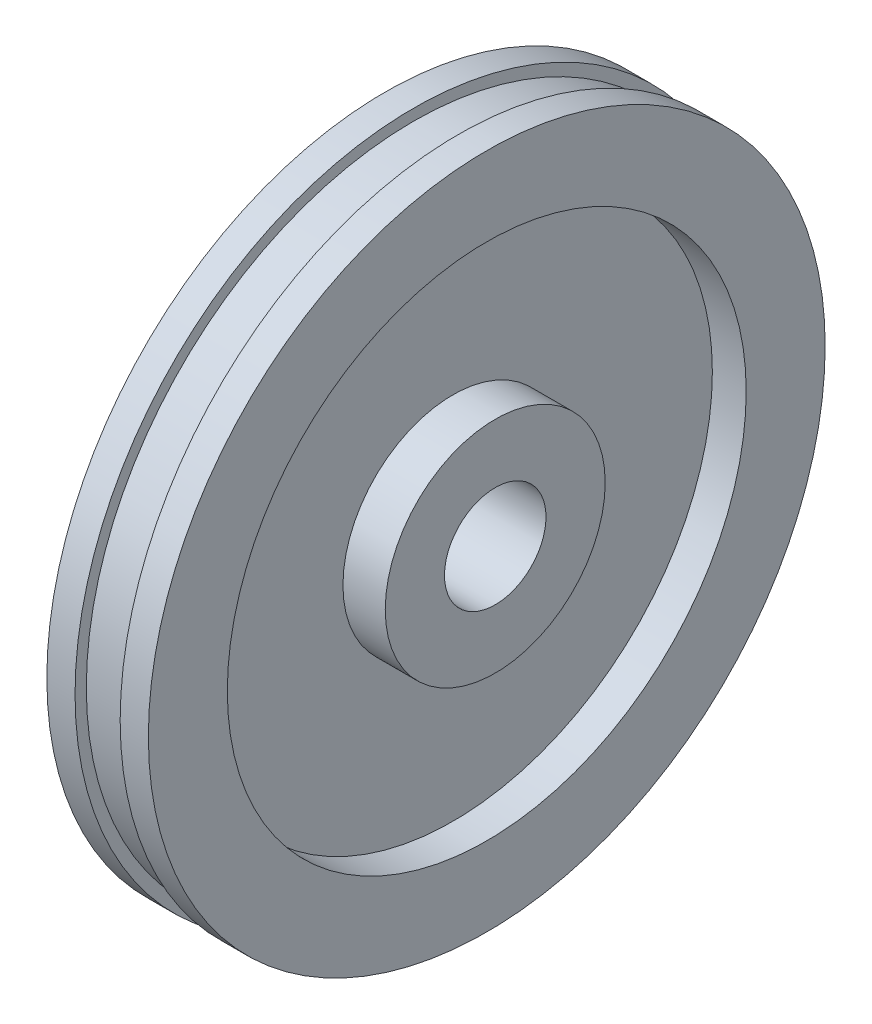
ISO-10303-21;
HEADER;
FILE_DESCRIPTION(('STEP AP214'),'2;1');
FILE_NAME('part.step','',(''),(''),'','','');
FILE_SCHEMA(('AUTOMOTIVE_DESIGN { 1 0 10303 214 1 1 1 1 }'));
ENDSEC;
DATA;
#1=APPLICATION_CONTEXT('core data for automotive mechanical design processes');
#2=APPLICATION_PROTOCOL_DEFINITION('international standard','automotive_design',2000,#1);
#3=PRODUCT_CONTEXT('',#1,'mechanical');
#4=PRODUCT('Part','Part','',(#3));
#5=PRODUCT_RELATED_PRODUCT_CATEGORY('part','',(#4));
#6=PRODUCT_DEFINITION_FORMATION('','',#4);
#7=PRODUCT_DEFINITION_CONTEXT('part definition',#1,'design');
#8=PRODUCT_DEFINITION('design','',#6,#7);
#9=PRODUCT_DEFINITION_SHAPE('','',#8);
#10=(LENGTH_UNIT() NAMED_UNIT(*) SI_UNIT(.MILLI.,.METRE.));
#11=(NAMED_UNIT(*) PLANE_ANGLE_UNIT() SI_UNIT($,.RADIAN.));
#12=(NAMED_UNIT(*) SI_UNIT($,.STERADIAN.) SOLID_ANGLE_UNIT());
#13=UNCERTAINTY_MEASURE_WITH_UNIT(LENGTH_MEASURE(1.E-05),#10,'distance_accuracy_value','');
#14=(GEOMETRIC_REPRESENTATION_CONTEXT(3) GLOBAL_UNCERTAINTY_ASSIGNED_CONTEXT((#13)) GLOBAL_UNIT_ASSIGNED_CONTEXT((#10,
#11,#12)) REPRESENTATION_CONTEXT('',''));
#15=CARTESIAN_POINT('',(0.,0.,0.));
#16=DIRECTION('',(0.,0.,1.));
#17=DIRECTION('',(1.,0.,0.));
#18=AXIS2_PLACEMENT_3D('',#15,#16,#17);
#19=CARTESIAN_POINT('',(0.,10.5,0.));
#20=DIRECTION('',(1.,0.,0.));
#21=DIRECTION('',(0.,0.,-1.));
#22=AXIS2_PLACEMENT_3D('',#19,#20,#21);
#23=PLANE('',#22);
#24=CARTESIAN_POINT('',(0.,-9.,0.));
#25=DIRECTION('',(-1.,0.,0.));
#26=DIRECTION('',(0.,0.,1.));
#27=AXIS2_PLACEMENT_3D('',#24,#25,#26);
#28=CIRCLE('',#27,9.);
#29=CARTESIAN_POINT('',(0.,-9.,9.));
#30=VERTEX_POINT('',#29);
#31=EDGE_CURVE('E10',#30,#30,#28,.T.);
#32=ORIENTED_EDGE('',*,*,#31,.F.);
#33=EDGE_LOOP('',(#32));
#34=FACE_BOUND('',#33,.T.);
#35=CARTESIAN_POINT('',(0.,-9.,0.));
#36=DIRECTION('',(-1.,0.,0.));
#37=DIRECTION('',(0.,0.,1.));
#38=AXIS2_PLACEMENT_3D('',#35,#36,#37);
#39=CIRCLE('',#38,19.5);
#40=CARTESIAN_POINT('',(0.,-9.,19.5));
#41=VERTEX_POINT('',#40);
#42=EDGE_CURVE('E89',#41,#41,#39,.T.);
#43=ORIENTED_EDGE('',*,*,#42,.T.);
#44=EDGE_LOOP('',(#43));
#45=FACE_BOUND('',#44,.T.);
#46=ADVANCED_FACE('F37',(#34,#45),#23,.F.);
#47=CARTESIAN_POINT('',(0.,-9.,0.));
#48=DIRECTION('',(-1.,0.,0.));
#49=DIRECTION('',(0.,0.,1.));
#50=AXIS2_PLACEMENT_3D('',#47,#48,#49);
#51=CYLINDRICAL_SURFACE('',#50,9.);
#52=CARTESIAN_POINT('',(21.,-9.,0.));
#53=DIRECTION('',(-1.,0.,0.));
#54=DIRECTION('',(0.,0.,1.));
#55=AXIS2_PLACEMENT_3D('',#52,#53,#54);
#56=CIRCLE('',#55,9.);
#57=CARTESIAN_POINT('',(21.,-9.,9.));
#58=VERTEX_POINT('',#57);
#59=EDGE_CURVE('E43',#58,#58,#56,.T.);
#60=ORIENTED_EDGE('',*,*,#59,.F.);
#61=EDGE_LOOP('',(#60));
#62=FACE_BOUND('',#61,.T.);
#63=ORIENTED_EDGE('',*,*,#31,.T.);
#64=EDGE_LOOP('',(#63));
#65=FACE_BOUND('',#64,.T.);
#66=ADVANCED_FACE('F174',(#62,#65),#51,.F.);
#67=CARTESIAN_POINT('',(21.,0.,0.));
#68=DIRECTION('',(-1.,0.,0.));
#69=DIRECTION('',(0.,0.,1.));
#70=AXIS2_PLACEMENT_3D('',#67,#68,#69);
#71=PLANE('',#70);
#72=CARTESIAN_POINT('',(21.,-9.,0.));
#73=DIRECTION('',(-1.,0.,0.));
#74=DIRECTION('',(0.,0.,1.));
#75=AXIS2_PLACEMENT_3D('',#72,#73,#74);
#76=CIRCLE('',#75,19.5);
#77=CARTESIAN_POINT('',(21.,-9.,19.5));
#78=VERTEX_POINT('',#77);
#79=EDGE_CURVE('E47',#78,#78,#76,.T.);
#80=ORIENTED_EDGE('',*,*,#79,.F.);
#81=EDGE_LOOP('',(#80));
#82=FACE_BOUND('',#81,.T.);
#83=ORIENTED_EDGE('',*,*,#59,.T.);
#84=EDGE_LOOP('',(#83));
#85=FACE_BOUND('',#84,.T.);
#86=ADVANCED_FACE('F169',(#82,#85),#71,.F.);
#87=CARTESIAN_POINT('',(0.,-9.,0.));
#88=DIRECTION('',(-1.,0.,0.));
#89=DIRECTION('',(0.,0.,1.));
#90=AXIS2_PLACEMENT_3D('',#87,#88,#89);
#91=CYLINDRICAL_SURFACE('',#90,19.5);
#92=CARTESIAN_POINT('',(13.5,-9.,0.));
#93=DIRECTION('',(-1.,0.,0.));
#94=DIRECTION('',(0.,0.,1.));
#95=AXIS2_PLACEMENT_3D('',#92,#93,#94);
#96=CIRCLE('',#95,19.5);
#97=CARTESIAN_POINT('',(13.5,-9.,19.5));
#98=VERTEX_POINT('',#97);
#99=EDGE_CURVE('E51',#98,#98,#96,.T.);
#100=ORIENTED_EDGE('',*,*,#99,.F.);
#101=EDGE_LOOP('',(#100));
#102=FACE_BOUND('',#101,.T.);
#103=ORIENTED_EDGE('',*,*,#79,.T.);
#104=EDGE_LOOP('',(#103));
#105=FACE_BOUND('',#104,.T.);
#106=ADVANCED_FACE('F163',(#102,#105),#91,.T.);
#107=CARTESIAN_POINT('',(13.5,10.5,0.));
#108=DIRECTION('',(-1.,0.,0.));
#109=DIRECTION('',(0.,0.,1.));
#110=AXIS2_PLACEMENT_3D('',#107,#108,#109);
#111=PLANE('',#110);
#112=CARTESIAN_POINT('',(13.5,-9.,0.));
#113=DIRECTION('',(-1.,0.,0.));
#114=DIRECTION('',(0.,0.,1.));
#115=AXIS2_PLACEMENT_3D('',#112,#113,#114);
#116=CIRCLE('',#115,46.);
#117=CARTESIAN_POINT('',(13.5,-9.,46.));
#118=VERTEX_POINT('',#117);
#119=EDGE_CURVE('E56',#118,#118,#116,.T.);
#120=ORIENTED_EDGE('',*,*,#119,.F.);
#121=EDGE_LOOP('',(#120));
#122=FACE_BOUND('',#121,.T.);
#123=ORIENTED_EDGE('',*,*,#99,.T.);
#124=EDGE_LOOP('',(#123));
#125=FACE_BOUND('',#124,.T.);
#126=ADVANCED_FACE('F157',(#122,#125),#111,.F.);
#127=CARTESIAN_POINT('',(0.,-9.,0.));
#128=DIRECTION('',(-1.,0.,0.));
#129=DIRECTION('',(0.,0.,1.));
#130=AXIS2_PLACEMENT_3D('',#127,#128,#129);
#131=CYLINDRICAL_SURFACE('',#130,46.);
#132=CARTESIAN_POINT('',(19.5,-9.,0.));
#133=DIRECTION('',(-1.,0.,0.));
#134=DIRECTION('',(0.,0.,1.));
#135=AXIS2_PLACEMENT_3D('',#132,#133,#134);
#136=CIRCLE('',#135,46.);
#137=CARTESIAN_POINT('',(19.5,-9.,46.));
#138=VERTEX_POINT('',#137);
#139=EDGE_CURVE('E59',#138,#138,#136,.T.);
#140=ORIENTED_EDGE('',*,*,#139,.F.);
#141=EDGE_LOOP('',(#140));
#142=FACE_BOUND('',#141,.T.);
#143=ORIENTED_EDGE('',*,*,#119,.T.);
#144=EDGE_LOOP('',(#143));
#145=FACE_BOUND('',#144,.T.);
#146=ADVANCED_FACE('F151',(#142,#145),#131,.F.);
#147=CARTESIAN_POINT('',(19.5,37.,0.));
#148=DIRECTION('',(-1.,0.,0.));
#149=DIRECTION('',(0.,0.,1.));
#150=AXIS2_PLACEMENT_3D('',#147,#148,#149);
#151=PLANE('',#150);
#152=CARTESIAN_POINT('',(19.5,-9.,0.));
#153=DIRECTION('',(-1.,0.,0.));
#154=DIRECTION('',(0.,0.,1.));
#155=AXIS2_PLACEMENT_3D('',#152,#153,#154);
#156=CIRCLE('',#155,60.);
#157=CARTESIAN_POINT('',(19.5,-9.,60.));
#158=VERTEX_POINT('',#157);
#159=EDGE_CURVE('E62',#158,#158,#156,.T.);
#160=ORIENTED_EDGE('',*,*,#159,.F.);
#161=EDGE_LOOP('',(#160));
#162=FACE_BOUND('',#161,.T.);
#163=ORIENTED_EDGE('',*,*,#139,.T.);
#164=EDGE_LOOP('',(#163));
#165=FACE_BOUND('',#164,.T.);
#166=ADVANCED_FACE('F145',(#162,#165),#151,.F.);
#167=CARTESIAN_POINT('',(0.,-9.,0.));
#168=DIRECTION('',(-1.,0.,0.));
#169=DIRECTION('',(0.,0.,1.));
#170=AXIS2_PLACEMENT_3D('',#167,#168,#169);
#171=CYLINDRICAL_SURFACE('',#170,60.);
#172=CARTESIAN_POINT('',(14.5,-9.,0.));
#173=DIRECTION('',(-1.,0.,0.));
#174=DIRECTION('',(0.,0.,1.));
#175=AXIS2_PLACEMENT_3D('',#172,#173,#174);
#176=CIRCLE('',#175,60.);
#177=CARTESIAN_POINT('',(14.5,-9.,60.));
#178=VERTEX_POINT('',#177);
#179=EDGE_CURVE('E65',#178,#178,#176,.T.);
#180=ORIENTED_EDGE('',*,*,#179,.F.);
#181=EDGE_LOOP('',(#180));
#182=FACE_BOUND('',#181,.T.);
#183=ORIENTED_EDGE('',*,*,#159,.T.);
#184=EDGE_LOOP('',(#183));
#185=FACE_BOUND('',#184,.T.);
#186=ADVANCED_FACE('F139',(#182,#185),#171,.T.);
#187=CARTESIAN_POINT('',(14.5,51.,0.));
#188=DIRECTION('',(1.,0.,0.));
#189=DIRECTION('',(0.,0.,-1.));
#190=AXIS2_PLACEMENT_3D('',#187,#188,#189);
#191=PLANE('',#190);
#192=CARTESIAN_POINT('',(14.5,-9.,0.));
#193=DIRECTION('',(-1.,0.,0.));
#194=DIRECTION('',(0.,0.,1.));
#195=AXIS2_PLACEMENT_3D('',#192,#193,#194);
#196=CIRCLE('',#195,58.);
#197=CARTESIAN_POINT('',(14.5,-9.,58.));
#198=VERTEX_POINT('',#197);
#199=EDGE_CURVE('E68',#198,#198,#196,.T.);
#200=ORIENTED_EDGE('',*,*,#199,.F.);
#201=EDGE_LOOP('',(#200));
#202=FACE_BOUND('',#201,.T.);
#203=ORIENTED_EDGE('',*,*,#179,.T.);
#204=EDGE_LOOP('',(#203));
#205=FACE_BOUND('',#204,.T.);
#206=ADVANCED_FACE('F133',(#202,#205),#191,.F.);
#207=CARTESIAN_POINT('',(0.,-9.,0.));
#208=DIRECTION('',(-1.,0.,0.));
#209=DIRECTION('',(0.,0.,1.));
#210=AXIS2_PLACEMENT_3D('',#207,#208,#209);
#211=CYLINDRICAL_SURFACE('',#210,58.);
#212=CARTESIAN_POINT('',(6.5,-9.,0.));
#213=DIRECTION('',(-1.,0.,0.));
#214=DIRECTION('',(0.,0.,1.));
#215=AXIS2_PLACEMENT_3D('',#212,#213,#214);
#216=CIRCLE('',#215,58.);
#217=CARTESIAN_POINT('',(6.5,-9.,58.));
#218=VERTEX_POINT('',#217);
#219=EDGE_CURVE('E71',#218,#218,#216,.T.);
#220=ORIENTED_EDGE('',*,*,#219,.F.);
#221=EDGE_LOOP('',(#220));
#222=FACE_BOUND('',#221,.T.);
#223=ORIENTED_EDGE('',*,*,#199,.T.);
#224=EDGE_LOOP('',(#223));
#225=FACE_BOUND('',#224,.T.);
#226=ADVANCED_FACE('F127',(#222,#225),#211,.T.);
#227=CARTESIAN_POINT('',(6.5,49.,0.));
#228=DIRECTION('',(-1.,0.,0.));
#229=DIRECTION('',(0.,0.,1.));
#230=AXIS2_PLACEMENT_3D('',#227,#228,#229);
#231=PLANE('',#230);
#232=CARTESIAN_POINT('',(6.5,-9.,0.));
#233=DIRECTION('',(-1.,0.,0.));
#234=DIRECTION('',(0.,0.,1.));
#235=AXIS2_PLACEMENT_3D('',#232,#233,#234);
#236=CIRCLE('',#235,60.);
#237=CARTESIAN_POINT('',(6.5,-9.,60.));
#238=VERTEX_POINT('',#237);
#239=EDGE_CURVE('E74',#238,#238,#236,.T.);
#240=ORIENTED_EDGE('',*,*,#239,.F.);
#241=EDGE_LOOP('',(#240));
#242=FACE_BOUND('',#241,.T.);
#243=ORIENTED_EDGE('',*,*,#219,.T.);
#244=EDGE_LOOP('',(#243));
#245=FACE_BOUND('',#244,.T.);
#246=ADVANCED_FACE('F121',(#242,#245),#231,.F.);
#247=CARTESIAN_POINT('',(0.,-9.,0.));
#248=DIRECTION('',(-1.,0.,0.));
#249=DIRECTION('',(0.,0.,1.));
#250=AXIS2_PLACEMENT_3D('',#247,#248,#249);
#251=CYLINDRICAL_SURFACE('',#250,60.);
#252=CARTESIAN_POINT('',(1.5,-9.,0.));
#253=DIRECTION('',(-1.,0.,0.));
#254=DIRECTION('',(0.,0.,1.));
#255=AXIS2_PLACEMENT_3D('',#252,#253,#254);
#256=CIRCLE('',#255,60.);
#257=CARTESIAN_POINT('',(1.5,-9.,60.));
#258=VERTEX_POINT('',#257);
#259=EDGE_CURVE('E77',#258,#258,#256,.T.);
#260=ORIENTED_EDGE('',*,*,#259,.F.);
#261=EDGE_LOOP('',(#260));
#262=FACE_BOUND('',#261,.T.);
#263=ORIENTED_EDGE('',*,*,#239,.T.);
#264=EDGE_LOOP('',(#263));
#265=FACE_BOUND('',#264,.T.);
#266=ADVANCED_FACE('F115',(#262,#265),#251,.T.);
#267=CARTESIAN_POINT('',(1.5,51.,0.));
#268=DIRECTION('',(1.,0.,0.));
#269=DIRECTION('',(0.,0.,-1.));
#270=AXIS2_PLACEMENT_3D('',#267,#268,#269);
#271=PLANE('',#270);
#272=CARTESIAN_POINT('',(1.5,-9.,0.));
#273=DIRECTION('',(-1.,0.,0.));
#274=DIRECTION('',(0.,0.,1.));
#275=AXIS2_PLACEMENT_3D('',#272,#273,#274);
#276=CIRCLE('',#275,46.);
#277=CARTESIAN_POINT('',(1.5,-9.,46.));
#278=VERTEX_POINT('',#277);
#279=EDGE_CURVE('E80',#278,#278,#276,.T.);
#280=ORIENTED_EDGE('',*,*,#279,.F.);
#281=EDGE_LOOP('',(#280));
#282=FACE_BOUND('',#281,.T.);
#283=ORIENTED_EDGE('',*,*,#259,.T.);
#284=EDGE_LOOP('',(#283));
#285=FACE_BOUND('',#284,.T.);
#286=ADVANCED_FACE('F109',(#282,#285),#271,.F.);
#287=CARTESIAN_POINT('',(0.,-9.,0.));
#288=DIRECTION('',(-1.,0.,0.));
#289=DIRECTION('',(0.,0.,1.));
#290=AXIS2_PLACEMENT_3D('',#287,#288,#289);
#291=CYLINDRICAL_SURFACE('',#290,46.);
#292=CARTESIAN_POINT('',(7.5,-9.,0.));
#293=DIRECTION('',(-1.,0.,0.));
#294=DIRECTION('',(0.,0.,1.));
#295=AXIS2_PLACEMENT_3D('',#292,#293,#294);
#296=CIRCLE('',#295,46.);
#297=CARTESIAN_POINT('',(7.5,-9.,46.));
#298=VERTEX_POINT('',#297);
#299=EDGE_CURVE('E83',#298,#298,#296,.T.);
#300=ORIENTED_EDGE('',*,*,#299,.F.);
#301=EDGE_LOOP('',(#300));
#302=FACE_BOUND('',#301,.T.);
#303=ORIENTED_EDGE('',*,*,#279,.T.);
#304=EDGE_LOOP('',(#303));
#305=FACE_BOUND('',#304,.T.);
#306=ADVANCED_FACE('F103',(#302,#305),#291,.F.);
#307=CARTESIAN_POINT('',(7.5,37.,0.));
#308=DIRECTION('',(1.,0.,0.));
#309=DIRECTION('',(0.,0.,-1.));
#310=AXIS2_PLACEMENT_3D('',#307,#308,#309);
#311=PLANE('',#310);
#312=CARTESIAN_POINT('',(7.5,-9.,0.));
#313=DIRECTION('',(-1.,0.,0.));
#314=DIRECTION('',(0.,0.,1.));
#315=AXIS2_PLACEMENT_3D('',#312,#313,#314);
#316=CIRCLE('',#315,19.5);
#317=CARTESIAN_POINT('',(7.5,-9.,19.5));
#318=VERTEX_POINT('',#317);
#319=EDGE_CURVE('E86',#318,#318,#316,.T.);
#320=ORIENTED_EDGE('',*,*,#319,.F.);
#321=EDGE_LOOP('',(#320));
#322=FACE_BOUND('',#321,.T.);
#323=ORIENTED_EDGE('',*,*,#299,.T.);
#324=EDGE_LOOP('',(#323));
#325=FACE_BOUND('',#324,.T.);
#326=ADVANCED_FACE('F97',(#322,#325),#311,.F.);
#327=CARTESIAN_POINT('',(0.,-9.,0.));
#328=DIRECTION('',(-1.,0.,0.));
#329=DIRECTION('',(0.,0.,1.));
#330=AXIS2_PLACEMENT_3D('',#327,#328,#329);
#331=CYLINDRICAL_SURFACE('',#330,19.5);
#332=ORIENTED_EDGE('',*,*,#42,.F.);
#333=EDGE_LOOP('',(#332));
#334=FACE_BOUND('',#333,.T.);
#335=ORIENTED_EDGE('',*,*,#319,.T.);
#336=EDGE_LOOP('',(#335));
#337=FACE_BOUND('',#336,.T.);
#338=ADVANCED_FACE('F94',(#334,#337),#331,.T.);
#339=CLOSED_SHELL('',(#46,#66,#86,#106,#126,#146,#166,#186,#206,#226,#246,#266,#286,#306,#326,#338));
#340=MANIFOLD_SOLID_BREP('B2',#339);
#341=ADVANCED_BREP_SHAPE_REPRESENTATION('',(#18,#340),#14);
#342=SHAPE_DEFINITION_REPRESENTATION(#9,#341);
ENDSEC;
END-ISO-10303-21;
